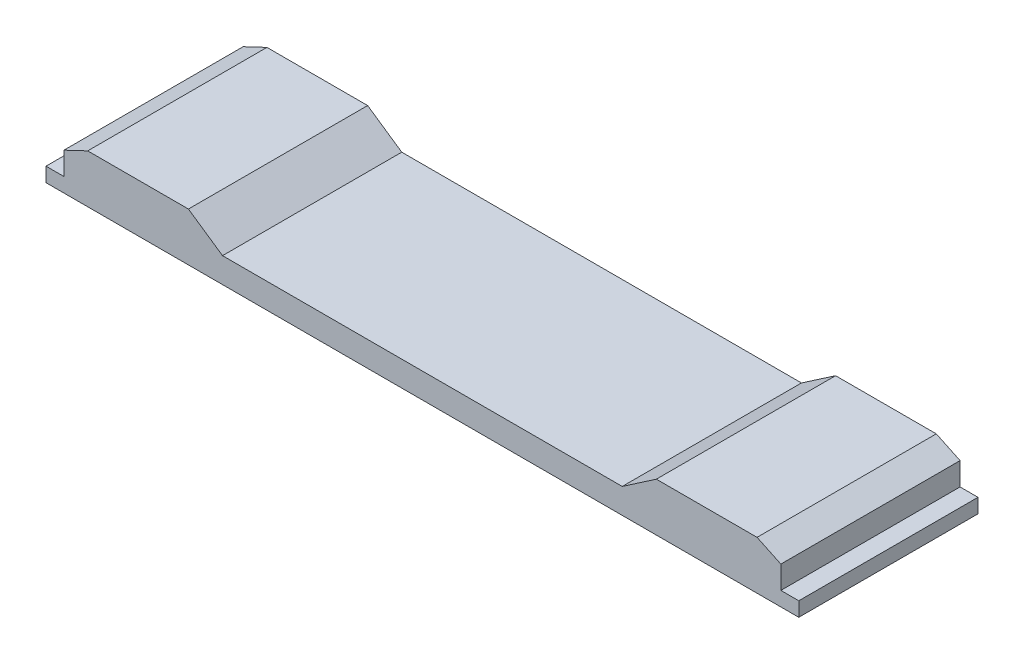
ISO-10303-21;
HEADER;
FILE_DESCRIPTION(('STEP AP214'),'2;1');
FILE_NAME('part.step','',(''),(''),'','','');
FILE_SCHEMA(('AUTOMOTIVE_DESIGN { 1 0 10303 214 1 1 1 1 }'));
ENDSEC;
DATA;
#1=APPLICATION_CONTEXT('core data for automotive mechanical design processes');
#2=APPLICATION_PROTOCOL_DEFINITION('international standard','automotive_design',2000,#1);
#3=PRODUCT_CONTEXT('',#1,'mechanical');
#4=PRODUCT('Part','Part','',(#3));
#5=PRODUCT_RELATED_PRODUCT_CATEGORY('part','',(#4));
#6=PRODUCT_DEFINITION_FORMATION('','',#4);
#7=PRODUCT_DEFINITION_CONTEXT('part definition',#1,'design');
#8=PRODUCT_DEFINITION('design','',#6,#7);
#9=PRODUCT_DEFINITION_SHAPE('','',#8);
#10=(LENGTH_UNIT() NAMED_UNIT(*) SI_UNIT(.MILLI.,.METRE.));
#11=(NAMED_UNIT(*) PLANE_ANGLE_UNIT() SI_UNIT($,.RADIAN.));
#12=(NAMED_UNIT(*) SI_UNIT($,.STERADIAN.) SOLID_ANGLE_UNIT());
#13=UNCERTAINTY_MEASURE_WITH_UNIT(LENGTH_MEASURE(1.E-05),#10,'distance_accuracy_value','');
#14=(GEOMETRIC_REPRESENTATION_CONTEXT(3) GLOBAL_UNCERTAINTY_ASSIGNED_CONTEXT((#13)) GLOBAL_UNIT_ASSIGNED_CONTEXT((#10,
#11,#12)) REPRESENTATION_CONTEXT('',''));
#15=CARTESIAN_POINT('',(0.,0.,0.));
#16=DIRECTION('',(0.,0.,1.));
#17=DIRECTION('',(1.,0.,0.));
#18=AXIS2_PLACEMENT_3D('',#15,#16,#17);
#19=CARTESIAN_POINT('',(21.,26.3300000000003,10.));
#20=DIRECTION('',(-1.,0.,0.));
#21=DIRECTION('',(0.,-1.,0.));
#22=AXIS2_PLACEMENT_3D('',#19,#20,#21);
#23=PLANE('',#22);
#24=DIRECTION('',(0.,1.,0.));
#25=VECTOR('',#24,1.);
#26=CARTESIAN_POINT('',(21.,26.3300000000003,0.));
#27=LINE('',#26,#25);
#28=CARTESIAN_POINT('',(21.,26.3300000000003,0.));
#29=VERTEX_POINT('',#28);
#30=CARTESIAN_POINT('',(21.,27.1300000000003,0.));
#31=VERTEX_POINT('',#30);
#32=EDGE_CURVE('E168',#29,#31,#27,.T.);
#33=ORIENTED_EDGE('',*,*,#32,.T.);
#34=DIRECTION('',(0.,0.,-1.));
#35=VECTOR('',#34,1.);
#36=CARTESIAN_POINT('',(21.,27.1300000000003,10.));
#37=LINE('',#36,#35);
#38=CARTESIAN_POINT('',(21.,27.1300000000003,10.));
#39=VERTEX_POINT('',#38);
#40=EDGE_CURVE('E11',#39,#31,#37,.T.);
#41=ORIENTED_EDGE('',*,*,#40,.F.);
#42=DIRECTION('',(0.,1.,0.));
#43=VECTOR('',#42,1.);
#44=CARTESIAN_POINT('',(21.,26.3300000000003,10.));
#45=LINE('',#44,#43);
#46=CARTESIAN_POINT('',(21.,26.3300000000003,10.));
#47=VERTEX_POINT('',#46);
#48=EDGE_CURVE('E195',#47,#39,#45,.T.);
#49=ORIENTED_EDGE('',*,*,#48,.F.);
#50=DIRECTION('',(0.,0.,-1.));
#51=VECTOR('',#50,1.);
#52=CARTESIAN_POINT('',(21.,26.3300000000003,10.));
#53=LINE('',#52,#51);
#54=EDGE_CURVE('E164',#47,#29,#53,.T.);
#55=ORIENTED_EDGE('',*,*,#54,.T.);
#56=EDGE_LOOP('',(#33,#41,#49,#55));
#57=FACE_BOUND('',#56,.T.);
#58=ADVANCED_FACE('F35',(#57),#23,.F.);
#59=CARTESIAN_POINT('',(20.,27.1300000000004,10.));
#60=DIRECTION('',(0.,-1.,0.));
#61=DIRECTION('',(1.,0.,0.));
#62=AXIS2_PLACEMENT_3D('',#59,#60,#61);
#63=PLANE('',#62);
#64=DIRECTION('',(-1.,0.,0.));
#65=VECTOR('',#64,1.);
#66=CARTESIAN_POINT('',(20.,27.1300000000004,0.));
#67=LINE('',#66,#65);
#68=CARTESIAN_POINT('',(20.,27.1300000000004,0.));
#69=VERTEX_POINT('',#68);
#70=EDGE_CURVE('E171',#31,#69,#67,.T.);
#71=ORIENTED_EDGE('',*,*,#70,.T.);
#72=DIRECTION('',(0.,0.,-1.));
#73=VECTOR('',#72,1.);
#74=CARTESIAN_POINT('',(20.,27.1300000000004,10.));
#75=LINE('',#74,#73);
#76=CARTESIAN_POINT('',(20.,27.1300000000004,10.));
#77=VERTEX_POINT('',#76);
#78=EDGE_CURVE('E43',#77,#69,#75,.T.);
#79=ORIENTED_EDGE('',*,*,#78,.F.);
#80=DIRECTION('',(-1.,0.,0.));
#81=VECTOR('',#80,1.);
#82=CARTESIAN_POINT('',(20.,27.1300000000004,10.));
#83=LINE('',#82,#81);
#84=EDGE_CURVE('E110',#39,#77,#83,.T.);
#85=ORIENTED_EDGE('',*,*,#84,.F.);
#86=ORIENTED_EDGE('',*,*,#40,.T.);
#87=EDGE_LOOP('',(#71,#79,#85,#86));
#88=FACE_BOUND('',#87,.T.);
#89=ADVANCED_FACE('F273',(#88),#63,.F.);
#90=CARTESIAN_POINT('',(20.,27.1300000000004,10.));
#91=DIRECTION('',(-1.,0.,0.));
#92=DIRECTION('',(0.,-1.,0.));
#93=AXIS2_PLACEMENT_3D('',#90,#91,#92);
#94=PLANE('',#93);
#95=DIRECTION('',(0.,1.,0.));
#96=VECTOR('',#95,1.);
#97=CARTESIAN_POINT('',(20.,27.1300000000004,0.));
#98=LINE('',#97,#96);
#99=CARTESIAN_POINT('',(20.,28.4029973447382,0.));
#100=VERTEX_POINT('',#99);
#101=EDGE_CURVE('E173',#69,#100,#98,.T.);
#102=ORIENTED_EDGE('',*,*,#101,.T.);
#103=DIRECTION('',(0.,0.,-1.));
#104=VECTOR('',#103,1.);
#105=CARTESIAN_POINT('',(20.,28.4029973447382,10.));
#106=LINE('',#105,#104);
#107=CARTESIAN_POINT('',(20.,28.4029973447382,10.));
#108=VERTEX_POINT('',#107);
#109=EDGE_CURVE('E220',#108,#100,#106,.T.);
#110=ORIENTED_EDGE('',*,*,#109,.F.);
#111=DIRECTION('',(0.,1.,0.));
#112=VECTOR('',#111,1.);
#113=CARTESIAN_POINT('',(20.,27.1300000000004,10.));
#114=LINE('',#113,#112);
#115=EDGE_CURVE('E228',#77,#108,#114,.T.);
#116=ORIENTED_EDGE('',*,*,#115,.F.);
#117=ORIENTED_EDGE('',*,*,#78,.T.);
#118=EDGE_LOOP('',(#102,#110,#116,#117));
#119=FACE_BOUND('',#118,.T.);
#120=ADVANCED_FACE('F226',(#119),#94,.F.);
#121=CARTESIAN_POINT('',(18.673455449261,29.0320391081246,10.));
#122=DIRECTION('',(-0.428463796767612,-0.903558949299647,0.));
#123=DIRECTION('',(0.903558949299647,-0.428463796767612,0.));
#124=AXIS2_PLACEMENT_3D('',#121,#122,#123);
#125=PLANE('',#124);
#126=DIRECTION('',(-0.903558949299647,0.428463796767612,0.));
#127=VECTOR('',#126,1.);
#128=CARTESIAN_POINT('',(18.673455449261,29.0320391081246,0.));
#129=LINE('',#128,#127);
#130=CARTESIAN_POINT('',(18.673455449261,29.0320391081246,0.));
#131=VERTEX_POINT('',#130);
#132=EDGE_CURVE('E175',#100,#131,#129,.T.);
#133=ORIENTED_EDGE('',*,*,#132,.T.);
#134=DIRECTION('',(0.,0.,-1.));
#135=VECTOR('',#134,1.);
#136=CARTESIAN_POINT('',(18.673455449261,29.0320391081246,10.));
#137=LINE('',#136,#135);
#138=CARTESIAN_POINT('',(18.673455449261,29.0320391081246,10.));
#139=VERTEX_POINT('',#138);
#140=EDGE_CURVE('E217',#139,#131,#137,.T.);
#141=ORIENTED_EDGE('',*,*,#140,.F.);
#142=DIRECTION('',(-0.903558949299647,0.428463796767612,0.));
#143=VECTOR('',#142,1.);
#144=CARTESIAN_POINT('',(18.673455449261,29.0320391081246,10.));
#145=LINE('',#144,#143);
#146=EDGE_CURVE('E244',#108,#139,#145,.T.);
#147=ORIENTED_EDGE('',*,*,#146,.F.);
#148=ORIENTED_EDGE('',*,*,#109,.T.);
#149=EDGE_LOOP('',(#133,#141,#147,#148));
#150=FACE_BOUND('',#149,.T.);
#151=ADVANCED_FACE('F235',(#150),#125,.F.);
#152=CARTESIAN_POINT('',(13.0537408112336,29.0320391081246,10.));
#153=DIRECTION('',(0.,-1.,0.));
#154=DIRECTION('',(0.,0.,-1.));
#155=AXIS2_PLACEMENT_3D('',#152,#153,#154);
#156=PLANE('',#155);
#157=DIRECTION('',(-1.,0.,0.));
#158=VECTOR('',#157,1.);
#159=CARTESIAN_POINT('',(13.0537408112336,29.0320391081246,0.));
#160=LINE('',#159,#158);
#161=CARTESIAN_POINT('',(13.0537408112336,29.0320391081246,0.));
#162=VERTEX_POINT('',#161);
#163=EDGE_CURVE('E177',#131,#162,#160,.T.);
#164=ORIENTED_EDGE('',*,*,#163,.T.);
#165=DIRECTION('',(0.,0.,-1.));
#166=VECTOR('',#165,1.);
#167=CARTESIAN_POINT('',(13.0537408112336,29.0320391081246,10.));
#168=LINE('',#167,#166);
#169=CARTESIAN_POINT('',(13.0537408112336,29.0320391081246,10.));
#170=VERTEX_POINT('',#169);
#171=EDGE_CURVE('E214',#170,#162,#168,.T.);
#172=ORIENTED_EDGE('',*,*,#171,.F.);
#173=DIRECTION('',(-1.,0.,0.));
#174=VECTOR('',#173,1.);
#175=CARTESIAN_POINT('',(13.0537408112336,29.0320391081246,10.));
#176=LINE('',#175,#174);
#177=EDGE_CURVE('E241',#139,#170,#176,.T.);
#178=ORIENTED_EDGE('',*,*,#177,.F.);
#179=ORIENTED_EDGE('',*,*,#140,.T.);
#180=EDGE_LOOP('',(#164,#172,#178,#179));
#181=FACE_BOUND('',#180,.T.);
#182=ADVANCED_FACE('F239',(#181),#156,.F.);
#183=CARTESIAN_POINT('',(11.1507605762815,27.7300000000003,10.));
#184=DIRECTION('',(0.564683915591726,-0.825307261250013,0.));
#185=DIRECTION('',(0.825307261250013,0.564683915591726,0.));
#186=AXIS2_PLACEMENT_3D('',#183,#184,#185);
#187=PLANE('',#186);
#188=DIRECTION('',(-0.825307261250013,-0.564683915591726,0.));
#189=VECTOR('',#188,1.);
#190=CARTESIAN_POINT('',(11.1507605762815,27.7300000000003,0.));
#191=LINE('',#190,#189);
#192=CARTESIAN_POINT('',(11.1507605762815,27.7300000000003,0.));
#193=VERTEX_POINT('',#192);
#194=EDGE_CURVE('E179',#162,#193,#191,.T.);
#195=ORIENTED_EDGE('',*,*,#194,.T.);
#196=DIRECTION('',(0.,0.,-1.));
#197=VECTOR('',#196,1.);
#198=CARTESIAN_POINT('',(11.1507605762815,27.7300000000003,10.));
#199=LINE('',#198,#197);
#200=CARTESIAN_POINT('',(11.1507605762815,27.7300000000003,10.));
#201=VERTEX_POINT('',#200);
#202=EDGE_CURVE('E211',#201,#193,#199,.T.);
#203=ORIENTED_EDGE('',*,*,#202,.F.);
#204=DIRECTION('',(-0.825307261250013,-0.564683915591726,0.));
#205=VECTOR('',#204,1.);
#206=CARTESIAN_POINT('',(11.1507605762815,27.7300000000003,10.));
#207=LINE('',#206,#205);
#208=EDGE_CURVE('E243',#170,#201,#207,.T.);
#209=ORIENTED_EDGE('',*,*,#208,.F.);
#210=ORIENTED_EDGE('',*,*,#171,.T.);
#211=EDGE_LOOP('',(#195,#203,#209,#210));
#212=FACE_BOUND('',#211,.T.);
#213=ADVANCED_FACE('F285',(#212),#187,.F.);
#214=CARTESIAN_POINT('',(-11.1507605762815,27.7300000000003,10.));
#215=DIRECTION('',(0.,-1.,0.));
#216=DIRECTION('',(0.,0.,-1.));
#217=AXIS2_PLACEMENT_3D('',#214,#215,#216);
#218=PLANE('',#217);
#219=DIRECTION('',(-1.,0.,0.));
#220=VECTOR('',#219,1.);
#221=CARTESIAN_POINT('',(-11.1507605762815,27.7300000000003,0.));
#222=LINE('',#221,#220);
#223=CARTESIAN_POINT('',(-11.1507605762815,27.7300000000003,0.));
#224=VERTEX_POINT('',#223);
#225=EDGE_CURVE('E181',#193,#224,#222,.T.);
#226=ORIENTED_EDGE('',*,*,#225,.T.);
#227=DIRECTION('',(0.,0.,-1.));
#228=VECTOR('',#227,1.);
#229=CARTESIAN_POINT('',(-11.1507605762815,27.7300000000003,10.));
#230=LINE('',#229,#228);
#231=CARTESIAN_POINT('',(-11.1507605762815,27.7300000000003,10.));
#232=VERTEX_POINT('',#231);
#233=EDGE_CURVE('E208',#232,#224,#230,.T.);
#234=ORIENTED_EDGE('',*,*,#233,.F.);
#235=DIRECTION('',(-1.,0.,0.));
#236=VECTOR('',#235,1.);
#237=CARTESIAN_POINT('',(-11.1507605762815,27.7300000000003,10.));
#238=LINE('',#237,#236);
#239=EDGE_CURVE('E246',#201,#232,#238,.T.);
#240=ORIENTED_EDGE('',*,*,#239,.F.);
#241=ORIENTED_EDGE('',*,*,#202,.T.);
#242=EDGE_LOOP('',(#226,#234,#240,#241));
#243=FACE_BOUND('',#242,.T.);
#244=ADVANCED_FACE('F288',(#243),#218,.F.);
#245=CARTESIAN_POINT('',(-13.0537408112336,29.0320391081246,10.));
#246=DIRECTION('',(-0.564683915591738,-0.825307261250004,0.));
#247=DIRECTION('',(0.825307261250004,-0.564683915591738,0.));
#248=AXIS2_PLACEMENT_3D('',#245,#246,#247);
#249=PLANE('',#248);
#250=DIRECTION('',(-0.825307261250004,0.564683915591738,0.));
#251=VECTOR('',#250,1.);
#252=CARTESIAN_POINT('',(-13.0537408112336,29.0320391081246,0.));
#253=LINE('',#252,#251);
#254=CARTESIAN_POINT('',(-13.0537408112336,29.0320391081246,0.));
#255=VERTEX_POINT('',#254);
#256=EDGE_CURVE('E183',#224,#255,#253,.T.);
#257=ORIENTED_EDGE('',*,*,#256,.T.);
#258=DIRECTION('',(0.,0.,-1.));
#259=VECTOR('',#258,1.);
#260=CARTESIAN_POINT('',(-13.0537408112336,29.0320391081246,10.));
#261=LINE('',#260,#259);
#262=CARTESIAN_POINT('',(-13.0537408112336,29.0320391081246,10.));
#263=VERTEX_POINT('',#262);
#264=EDGE_CURVE('E205',#263,#255,#261,.T.);
#265=ORIENTED_EDGE('',*,*,#264,.F.);
#266=DIRECTION('',(-0.825307261250004,0.564683915591738,0.));
#267=VECTOR('',#266,1.);
#268=CARTESIAN_POINT('',(-13.0537408112336,29.0320391081246,10.));
#269=LINE('',#268,#267);
#270=EDGE_CURVE('E252',#232,#263,#269,.T.);
#271=ORIENTED_EDGE('',*,*,#270,.F.);
#272=ORIENTED_EDGE('',*,*,#233,.T.);
#273=EDGE_LOOP('',(#257,#265,#271,#272));
#274=FACE_BOUND('',#273,.T.);
#275=ADVANCED_FACE('F292',(#274),#249,.F.);
#276=CARTESIAN_POINT('',(-18.673455449261,29.0320391081246,10.));
#277=DIRECTION('',(0.,-1.,0.));
#278=DIRECTION('',(0.,0.,-1.));
#279=AXIS2_PLACEMENT_3D('',#276,#277,#278);
#280=PLANE('',#279);
#281=DIRECTION('',(-1.,0.,0.));
#282=VECTOR('',#281,1.);
#283=CARTESIAN_POINT('',(-18.673455449261,29.0320391081246,0.));
#284=LINE('',#283,#282);
#285=CARTESIAN_POINT('',(-18.673455449261,29.0320391081246,0.));
#286=VERTEX_POINT('',#285);
#287=EDGE_CURVE('E185',#255,#286,#284,.T.);
#288=ORIENTED_EDGE('',*,*,#287,.T.);
#289=DIRECTION('',(0.,0.,-1.));
#290=VECTOR('',#289,1.);
#291=CARTESIAN_POINT('',(-18.673455449261,29.0320391081246,10.));
#292=LINE('',#291,#290);
#293=CARTESIAN_POINT('',(-18.673455449261,29.0320391081246,10.));
#294=VERTEX_POINT('',#293);
#295=EDGE_CURVE('E202',#294,#286,#292,.T.);
#296=ORIENTED_EDGE('',*,*,#295,.F.);
#297=DIRECTION('',(-1.,0.,0.));
#298=VECTOR('',#297,1.);
#299=CARTESIAN_POINT('',(-18.673455449261,29.0320391081246,10.));
#300=LINE('',#299,#298);
#301=EDGE_CURVE('E254',#263,#294,#300,.T.);
#302=ORIENTED_EDGE('',*,*,#301,.F.);
#303=ORIENTED_EDGE('',*,*,#264,.T.);
#304=EDGE_LOOP('',(#288,#296,#302,#303));
#305=FACE_BOUND('',#304,.T.);
#306=ADVANCED_FACE('F296',(#305),#280,.F.);
#307=CARTESIAN_POINT('',(-20.,28.4029973447382,10.));
#308=DIRECTION('',(0.428463796767622,-0.903558949299642,0.));
#309=DIRECTION('',(0.903558949299642,0.428463796767622,0.));
#310=AXIS2_PLACEMENT_3D('',#307,#308,#309);
#311=PLANE('',#310);
#312=DIRECTION('',(-0.903558949299642,-0.428463796767623,0.));
#313=VECTOR('',#312,1.);
#314=CARTESIAN_POINT('',(-20.,28.4029973447382,0.));
#315=LINE('',#314,#313);
#316=CARTESIAN_POINT('',(-20.,28.4029973447382,0.));
#317=VERTEX_POINT('',#316);
#318=EDGE_CURVE('E187',#286,#317,#315,.T.);
#319=ORIENTED_EDGE('',*,*,#318,.T.);
#320=DIRECTION('',(0.,0.,-1.));
#321=VECTOR('',#320,1.);
#322=CARTESIAN_POINT('',(-20.,28.4029973447382,10.));
#323=LINE('',#322,#321);
#324=CARTESIAN_POINT('',(-20.,28.4029973447382,10.));
#325=VERTEX_POINT('',#324);
#326=EDGE_CURVE('E199',#325,#317,#323,.T.);
#327=ORIENTED_EDGE('',*,*,#326,.F.);
#328=DIRECTION('',(-0.903558949299642,-0.428463796767623,0.));
#329=VECTOR('',#328,1.);
#330=CARTESIAN_POINT('',(-20.,28.4029973447382,10.));
#331=LINE('',#330,#329);
#332=EDGE_CURVE('E256',#294,#325,#331,.T.);
#333=ORIENTED_EDGE('',*,*,#332,.F.);
#334=ORIENTED_EDGE('',*,*,#295,.T.);
#335=EDGE_LOOP('',(#319,#327,#333,#334));
#336=FACE_BOUND('',#335,.T.);
#337=ADVANCED_FACE('F262',(#336),#311,.F.);
#338=CARTESIAN_POINT('',(-20.,27.13,10.));
#339=DIRECTION('',(1.,0.,0.));
#340=DIRECTION('',(0.,0.,-1.));
#341=AXIS2_PLACEMENT_3D('',#338,#339,#340);
#342=PLANE('',#341);
#343=DIRECTION('',(0.,-1.,0.));
#344=VECTOR('',#343,1.);
#345=CARTESIAN_POINT('',(-20.,27.13,0.));
#346=LINE('',#345,#344);
#347=CARTESIAN_POINT('',(-20.,27.13,0.));
#348=VERTEX_POINT('',#347);
#349=EDGE_CURVE('E189',#317,#348,#346,.T.);
#350=ORIENTED_EDGE('',*,*,#349,.T.);
#351=DIRECTION('',(0.,0.,-1.));
#352=VECTOR('',#351,1.);
#353=CARTESIAN_POINT('',(-20.,27.13,10.));
#354=LINE('',#353,#352);
#355=CARTESIAN_POINT('',(-20.,27.13,10.));
#356=VERTEX_POINT('',#355);
#357=EDGE_CURVE('E159',#356,#348,#354,.T.);
#358=ORIENTED_EDGE('',*,*,#357,.F.);
#359=DIRECTION('',(0.,-1.,0.));
#360=VECTOR('',#359,1.);
#361=CARTESIAN_POINT('',(-20.,27.13,10.));
#362=LINE('',#361,#360);
#363=EDGE_CURVE('E148',#325,#356,#362,.T.);
#364=ORIENTED_EDGE('',*,*,#363,.F.);
#365=ORIENTED_EDGE('',*,*,#326,.T.);
#366=EDGE_LOOP('',(#350,#358,#364,#365));
#367=FACE_BOUND('',#366,.T.);
#368=ADVANCED_FACE('F266',(#367),#342,.F.);
#369=CARTESIAN_POINT('',(-20.,27.13,10.));
#370=DIRECTION('',(-3.36536354339497E-13,-1.,0.));
#371=DIRECTION('',(1.,-3.36536354339497E-13,0.));
#372=AXIS2_PLACEMENT_3D('',#369,#370,#371);
#373=PLANE('',#372);
#374=DIRECTION('',(-1.,3.36536354339497E-13,0.));
#375=VECTOR('',#374,1.);
#376=CARTESIAN_POINT('',(-20.,27.13,0.));
#377=LINE('',#376,#375);
#378=CARTESIAN_POINT('',(-21.,27.1300000000003,0.));
#379=VERTEX_POINT('',#378);
#380=EDGE_CURVE('E157',#348,#379,#377,.T.);
#381=ORIENTED_EDGE('',*,*,#380,.T.);
#382=DIRECTION('',(0.,0.,-1.));
#383=VECTOR('',#382,1.);
#384=CARTESIAN_POINT('',(-21.,27.1300000000003,10.));
#385=LINE('',#384,#383);
#386=CARTESIAN_POINT('',(-21.,27.1300000000003,10.));
#387=VERTEX_POINT('',#386);
#388=EDGE_CURVE('E154',#387,#379,#385,.T.);
#389=ORIENTED_EDGE('',*,*,#388,.F.);
#390=DIRECTION('',(-1.,3.36536354339497E-13,0.));
#391=VECTOR('',#390,1.);
#392=CARTESIAN_POINT('',(-20.,27.13,10.));
#393=LINE('',#392,#391);
#394=EDGE_CURVE('E141',#356,#387,#393,.T.);
#395=ORIENTED_EDGE('',*,*,#394,.F.);
#396=ORIENTED_EDGE('',*,*,#357,.T.);
#397=EDGE_LOOP('',(#381,#389,#395,#396));
#398=FACE_BOUND('',#397,.T.);
#399=ADVANCED_FACE('F155',(#398),#373,.F.);
#400=CARTESIAN_POINT('',(-21.,26.3300000000003,10.));
#401=DIRECTION('',(1.,0.,0.));
#402=DIRECTION('',(0.,1.,0.));
#403=AXIS2_PLACEMENT_3D('',#400,#401,#402);
#404=PLANE('',#403);
#405=DIRECTION('',(0.,-1.,0.));
#406=VECTOR('',#405,1.);
#407=CARTESIAN_POINT('',(-21.,26.3300000000003,0.));
#408=LINE('',#407,#406);
#409=CARTESIAN_POINT('',(-21.,26.3300000000003,0.));
#410=VERTEX_POINT('',#409);
#411=EDGE_CURVE('E192',#379,#410,#408,.T.);
#412=ORIENTED_EDGE('',*,*,#411,.T.);
#413=DIRECTION('',(0.,0.,-1.));
#414=VECTOR('',#413,1.);
#415=CARTESIAN_POINT('',(-21.,26.3300000000003,10.));
#416=LINE('',#415,#414);
#417=CARTESIAN_POINT('',(-21.,26.3300000000003,10.));
#418=VERTEX_POINT('',#417);
#419=EDGE_CURVE('E160',#418,#410,#416,.T.);
#420=ORIENTED_EDGE('',*,*,#419,.F.);
#421=DIRECTION('',(0.,-1.,0.));
#422=VECTOR('',#421,1.);
#423=CARTESIAN_POINT('',(-21.,26.3300000000003,10.));
#424=LINE('',#423,#422);
#425=EDGE_CURVE('E145',#387,#418,#424,.T.);
#426=ORIENTED_EDGE('',*,*,#425,.F.);
#427=ORIENTED_EDGE('',*,*,#388,.T.);
#428=EDGE_LOOP('',(#412,#420,#426,#427));
#429=FACE_BOUND('',#428,.T.);
#430=ADVANCED_FACE('F162',(#429),#404,.F.);
#431=CARTESIAN_POINT('',(20.,26.3300000000004,10.));
#432=DIRECTION('',(0.,1.,0.));
#433=DIRECTION('',(-1.,0.,0.));
#434=AXIS2_PLACEMENT_3D('',#431,#432,#433);
#435=PLANE('',#434);
#436=DIRECTION('',(1.,0.,0.));
#437=VECTOR('',#436,1.);
#438=CARTESIAN_POINT('',(20.,26.3300000000004,0.));
#439=LINE('',#438,#437);
#440=EDGE_CURVE('E98',#410,#29,#439,.T.);
#441=ORIENTED_EDGE('',*,*,#440,.T.);
#442=ORIENTED_EDGE('',*,*,#54,.F.);
#443=DIRECTION('',(1.,0.,0.));
#444=VECTOR('',#443,1.);
#445=CARTESIAN_POINT('',(-20.,26.3300000000004,10.));
#446=LINE('',#445,#444);
#447=EDGE_CURVE('E51',#418,#47,#446,.T.);
#448=ORIENTED_EDGE('',*,*,#447,.F.);
#449=ORIENTED_EDGE('',*,*,#419,.T.);
#450=EDGE_LOOP('',(#441,#442,#448,#449));
#451=FACE_BOUND('',#450,.T.);
#452=ADVANCED_FACE('F267',(#451),#435,.F.);
#453=CARTESIAN_POINT('',(0.,0.,10.));
#454=DIRECTION('',(0.,0.,-1.));
#455=DIRECTION('',(-1.,0.,0.));
#456=AXIS2_PLACEMENT_3D('',#453,#454,#455);
#457=PLANE('',#456);
#458=ORIENTED_EDGE('',*,*,#48,.T.);
#459=ORIENTED_EDGE('',*,*,#84,.T.);
#460=ORIENTED_EDGE('',*,*,#115,.T.);
#461=ORIENTED_EDGE('',*,*,#146,.T.);
#462=ORIENTED_EDGE('',*,*,#177,.T.);
#463=ORIENTED_EDGE('',*,*,#208,.T.);
#464=ORIENTED_EDGE('',*,*,#239,.T.);
#465=ORIENTED_EDGE('',*,*,#270,.T.);
#466=ORIENTED_EDGE('',*,*,#301,.T.);
#467=ORIENTED_EDGE('',*,*,#332,.T.);
#468=ORIENTED_EDGE('',*,*,#363,.T.);
#469=ORIENTED_EDGE('',*,*,#394,.T.);
#470=ORIENTED_EDGE('',*,*,#425,.T.);
#471=ORIENTED_EDGE('',*,*,#447,.T.);
#472=EDGE_LOOP('',(#458,#459,#460,#461,#462,#463,#464,#465,#466,#467,#468,#469,#470,#471));
#473=FACE_BOUND('',#472,.T.);
#474=ADVANCED_FACE('F143',(#473),#457,.F.);
#475=CARTESIAN_POINT('',(0.,0.,0.));
#476=DIRECTION('',(0.,0.,-1.));
#477=DIRECTION('',(-1.,0.,0.));
#478=AXIS2_PLACEMENT_3D('',#475,#476,#477);
#479=PLANE('',#478);
#480=ORIENTED_EDGE('',*,*,#32,.F.);
#481=ORIENTED_EDGE('',*,*,#440,.F.);
#482=ORIENTED_EDGE('',*,*,#411,.F.);
#483=ORIENTED_EDGE('',*,*,#380,.F.);
#484=ORIENTED_EDGE('',*,*,#349,.F.);
#485=ORIENTED_EDGE('',*,*,#318,.F.);
#486=ORIENTED_EDGE('',*,*,#287,.F.);
#487=ORIENTED_EDGE('',*,*,#256,.F.);
#488=ORIENTED_EDGE('',*,*,#225,.F.);
#489=ORIENTED_EDGE('',*,*,#194,.F.);
#490=ORIENTED_EDGE('',*,*,#163,.F.);
#491=ORIENTED_EDGE('',*,*,#132,.F.);
#492=ORIENTED_EDGE('',*,*,#101,.F.);
#493=ORIENTED_EDGE('',*,*,#70,.F.);
#494=EDGE_LOOP('',(#480,#481,#482,#483,#484,#485,#486,#487,#488,#489,#490,#491,#492,#493));
#495=FACE_BOUND('',#494,.T.);
#496=ADVANCED_FACE('F230',(#495),#479,.T.);
#497=CLOSED_SHELL('',(#58,#89,#120,#151,#182,#213,#244,#275,#306,#337,#368,#399,#430,#452,#474,#496));
#498=MANIFOLD_SOLID_BREP('B2',#497);
#499=ADVANCED_BREP_SHAPE_REPRESENTATION('',(#18,#498),#14);
#500=SHAPE_DEFINITION_REPRESENTATION(#9,#499);
ENDSEC;
END-ISO-10303-21;
